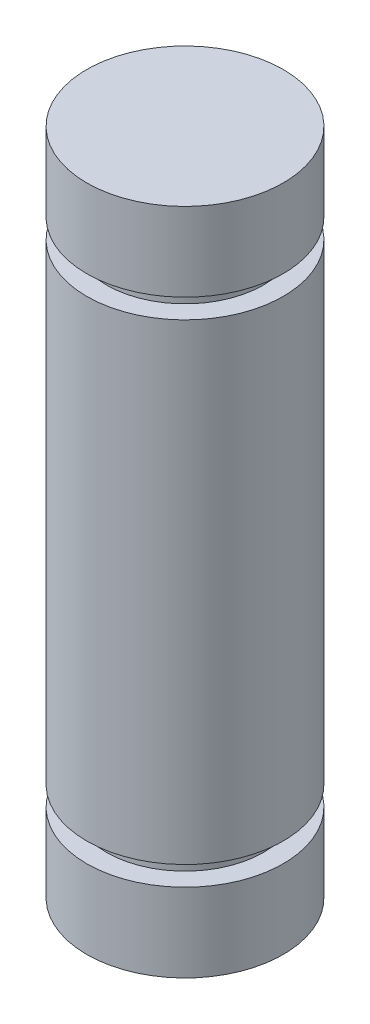
ISO-10303-21;
HEADER;
FILE_DESCRIPTION(('STEP AP214'),'2;1');
FILE_NAME('part.step','',(''),(''),'','','');
FILE_SCHEMA(('AUTOMOTIVE_DESIGN { 1 0 10303 214 1 1 1 1 }'));
ENDSEC;
DATA;
#1=APPLICATION_CONTEXT('core data for automotive mechanical design processes');
#2=APPLICATION_PROTOCOL_DEFINITION('international standard','automotive_design',2000,#1);
#3=PRODUCT_CONTEXT('',#1,'mechanical');
#4=PRODUCT('Part','Part','',(#3));
#5=PRODUCT_RELATED_PRODUCT_CATEGORY('part','',(#4));
#6=PRODUCT_DEFINITION_FORMATION('','',#4);
#7=PRODUCT_DEFINITION_CONTEXT('part definition',#1,'design');
#8=PRODUCT_DEFINITION('design','',#6,#7);
#9=PRODUCT_DEFINITION_SHAPE('','',#8);
#10=(LENGTH_UNIT() NAMED_UNIT(*) SI_UNIT(.MILLI.,.METRE.));
#11=(NAMED_UNIT(*) PLANE_ANGLE_UNIT() SI_UNIT($,.RADIAN.));
#12=(NAMED_UNIT(*) SI_UNIT($,.STERADIAN.) SOLID_ANGLE_UNIT());
#13=UNCERTAINTY_MEASURE_WITH_UNIT(LENGTH_MEASURE(1.E-05),#10,'distance_accuracy_value','');
#14=(GEOMETRIC_REPRESENTATION_CONTEXT(3) GLOBAL_UNCERTAINTY_ASSIGNED_CONTEXT((#13)) GLOBAL_UNIT_ASSIGNED_CONTEXT((#10,
#11,#12)) REPRESENTATION_CONTEXT('',''));
#15=CARTESIAN_POINT('',(0.,0.,0.));
#16=DIRECTION('',(0.,0.,1.));
#17=DIRECTION('',(1.,0.,0.));
#18=AXIS2_PLACEMENT_3D('',#15,#16,#17);
#19=CARTESIAN_POINT('',(0.,0.,0.));
#20=DIRECTION('',(0.,1.,0.));
#21=DIRECTION('',(0.,0.,1.));
#22=AXIS2_PLACEMENT_3D('',#19,#20,#21);
#23=PLANE('',#22);
#24=CARTESIAN_POINT('',(0.,0.,0.));
#25=DIRECTION('',(0.,1.,0.));
#26=DIRECTION('',(0.,0.,1.));
#27=AXIS2_PLACEMENT_3D('',#24,#25,#26);
#28=CIRCLE('',#27,6.35);
#29=CARTESIAN_POINT('',(0.,0.,-6.35));
#30=VERTEX_POINT('',#29);
#31=EDGE_CURVE('E42',#30,#30,#28,.T.);
#32=ORIENTED_EDGE('',*,*,#31,.F.);
#33=EDGE_LOOP('',(#32));
#34=FACE_BOUND('',#33,.T.);
#35=CARTESIAN_POINT('',(0.,0.,0.));
#36=DIRECTION('',(0.,1.,0.));
#37=DIRECTION('',(0.,0.,1.));
#38=AXIS2_PLACEMENT_3D('',#35,#36,#37);
#39=CIRCLE('',#38,5.08);
#40=CARTESIAN_POINT('',(0.,0.,5.08));
#41=VERTEX_POINT('',#40);
#42=EDGE_CURVE('E10',#41,#41,#39,.F.);
#43=ORIENTED_EDGE('',*,*,#42,.F.);
#44=EDGE_LOOP('',(#43));
#45=FACE_BOUND('',#44,.T.);
#46=ADVANCED_FACE('F31',(#34,#45),#23,.F.);
#47=CARTESIAN_POINT('',(0.,30.48,0.));
#48=DIRECTION('',(0.,1.,0.));
#49=DIRECTION('',(0.,0.,1.));
#50=AXIS2_PLACEMENT_3D('',#47,#48,#49);
#51=PLANE('',#50);
#52=CARTESIAN_POINT('',(0.,30.48,0.));
#53=DIRECTION('',(0.,1.,0.));
#54=DIRECTION('',(0.,0.,1.));
#55=AXIS2_PLACEMENT_3D('',#52,#53,#54);
#56=CIRCLE('',#55,6.35);
#57=CARTESIAN_POINT('',(0.,30.48,-6.35));
#58=VERTEX_POINT('',#57);
#59=EDGE_CURVE('E38',#58,#58,#56,.T.);
#60=ORIENTED_EDGE('',*,*,#59,.T.);
#61=EDGE_LOOP('',(#60));
#62=FACE_BOUND('',#61,.T.);
#63=CARTESIAN_POINT('',(0.,30.48,0.));
#64=DIRECTION('',(0.,1.,0.));
#65=DIRECTION('',(0.,0.,1.));
#66=AXIS2_PLACEMENT_3D('',#63,#64,#65);
#67=CIRCLE('',#66,5.08);
#68=CARTESIAN_POINT('',(0.,30.48,5.08));
#69=VERTEX_POINT('',#68);
#70=EDGE_CURVE('E49',#69,#69,#67,.T.);
#71=ORIENTED_EDGE('',*,*,#70,.F.);
#72=EDGE_LOOP('',(#71));
#73=FACE_BOUND('',#72,.T.);
#74=ADVANCED_FACE('F95',(#62,#73),#51,.T.);
#75=CARTESIAN_POINT('',(0.,30.48,0.));
#76=DIRECTION('',(0.,-1.,0.));
#77=DIRECTION('',(0.,0.,-1.));
#78=AXIS2_PLACEMENT_3D('',#75,#76,#77);
#79=CYLINDRICAL_SURFACE('',#78,6.35);
#80=CARTESIAN_POINT('',(0.,30.48,-6.35));
#81=CARTESIAN_POINT('',(0.,30.1625,-6.35));
#82=CARTESIAN_POINT('',(0.,29.845,-6.35));
#83=CARTESIAN_POINT('',(0.,29.21,-6.35));
#84=CARTESIAN_POINT('',(0.,28.8925,-6.35));
#85=CARTESIAN_POINT('',(0.,28.2575,-6.35));
#86=CARTESIAN_POINT('',(0.,27.94,-6.35));
#87=CARTESIAN_POINT('',(0.,27.305,-6.35));
#88=CARTESIAN_POINT('',(0.,26.9875,-6.35));
#89=CARTESIAN_POINT('',(0.,26.3525,-6.35));
#90=CARTESIAN_POINT('',(0.,26.035,-6.35));
#91=CARTESIAN_POINT('',(0.,25.4,-6.35));
#92=CARTESIAN_POINT('',(0.,25.0825,-6.35));
#93=CARTESIAN_POINT('',(0.,24.4475,-6.35));
#94=CARTESIAN_POINT('',(0.,24.13,-6.35));
#95=CARTESIAN_POINT('',(0.,23.495,-6.35));
#96=CARTESIAN_POINT('',(0.,23.1775,-6.35));
#97=CARTESIAN_POINT('',(0.,22.5425,-6.35));
#98=CARTESIAN_POINT('',(0.,22.225,-6.35));
#99=CARTESIAN_POINT('',(0.,21.59,-6.35));
#100=CARTESIAN_POINT('',(0.,21.2725,-6.35));
#101=CARTESIAN_POINT('',(0.,20.6375,-6.35));
#102=CARTESIAN_POINT('',(0.,20.32,-6.35));
#103=CARTESIAN_POINT('',(0.,19.685,-6.35));
#104=CARTESIAN_POINT('',(0.,19.3675,-6.35));
#105=CARTESIAN_POINT('',(0.,18.7325,-6.35));
#106=CARTESIAN_POINT('',(0.,18.415,-6.35));
#107=CARTESIAN_POINT('',(0.,17.78,-6.35));
#108=CARTESIAN_POINT('',(0.,17.4625,-6.35));
#109=CARTESIAN_POINT('',(0.,16.8275,-6.35));
#110=CARTESIAN_POINT('',(0.,16.51,-6.35));
#111=CARTESIAN_POINT('',(0.,15.875,-6.35));
#112=CARTESIAN_POINT('',(0.,15.5575,-6.35));
#113=CARTESIAN_POINT('',(0.,14.9225,-6.35));
#114=CARTESIAN_POINT('',(0.,14.605,-6.35));
#115=CARTESIAN_POINT('',(0.,13.97,-6.35));
#116=CARTESIAN_POINT('',(0.,13.6525,-6.35));
#117=CARTESIAN_POINT('',(0.,13.0175,-6.35));
#118=CARTESIAN_POINT('',(0.,12.7,-6.35));
#119=CARTESIAN_POINT('',(0.,12.065,-6.35));
#120=CARTESIAN_POINT('',(0.,11.7475,-6.35));
#121=CARTESIAN_POINT('',(0.,11.1125,-6.35));
#122=CARTESIAN_POINT('',(0.,10.795,-6.35));
#123=CARTESIAN_POINT('',(0.,10.16,-6.35));
#124=CARTESIAN_POINT('',(0.,9.8425,-6.35));
#125=CARTESIAN_POINT('',(0.,9.2075,-6.35));
#126=CARTESIAN_POINT('',(0.,8.89,-6.35));
#127=CARTESIAN_POINT('',(0.,8.255,-6.35));
#128=CARTESIAN_POINT('',(0.,7.9375,-6.35));
#129=CARTESIAN_POINT('',(0.,7.3025,-6.35));
#130=CARTESIAN_POINT('',(0.,6.985,-6.35));
#131=CARTESIAN_POINT('',(0.,6.35,-6.35));
#132=CARTESIAN_POINT('',(0.,6.0325,-6.35));
#133=CARTESIAN_POINT('',(0.,5.3975,-6.35));
#134=CARTESIAN_POINT('',(0.,5.08,-6.35));
#135=CARTESIAN_POINT('',(0.,4.445,-6.35));
#136=CARTESIAN_POINT('',(0.,4.1275,-6.35));
#137=CARTESIAN_POINT('',(0.,3.4925,-6.35));
#138=CARTESIAN_POINT('',(0.,3.175,-6.35));
#139=CARTESIAN_POINT('',(0.,2.54,-6.35));
#140=CARTESIAN_POINT('',(0.,2.2225,-6.35));
#141=CARTESIAN_POINT('',(0.,1.5875,-6.35));
#142=CARTESIAN_POINT('',(0.,1.27,-6.35));
#143=CARTESIAN_POINT('',(0.,0.634999999999999,-6.35));
#144=CARTESIAN_POINT('',(0.,0.3175,-6.35));
#145=CARTESIAN_POINT('',(0.,0.,-6.35));
#146=B_SPLINE_CURVE_WITH_KNOTS('',3,(#80,#81,#82,#83,#84,#85,#86,#87,#88,#89,#90,#91,#92,#93,
#94,#95,#96,#97,#98,#99,#100,#101,#102,#103,#104,#105,#106,#107,#108,#109,#110,#111,#112,#113,
#114,#115,#116,#117,#118,#119,#120,#121,#122,#123,#124,#125,#126,#127,#128,#129,#130,#131,#132,
#133,#134,#135,#136,#137,#138,#139,#140,#141,#142,#143,#144,#145),.UNSPECIFIED.,.F.,.F.,(4,2,2,
2,2,2,2,2,2,2,2,2,2,2,2,2,2,2,2,2,2,2,2,2,2,2,2,2,2,2,2,2,4),(0.,0.952499999999998,1.905,2.8575,
3.81,4.7625,5.715,6.6675,7.61999999999999,8.5725,9.525,10.4775,11.43,12.3825,13.335,14.2875,
15.24,16.1925,17.145,18.0975,19.05,20.0025,20.955,21.9075,22.86,23.8125,24.765,25.7175,26.67,
27.6225,28.575,29.5275,30.48),.UNSPECIFIED.);
#147=EDGE_CURVE('BSEAM33',#58,#30,#146,.T.);
#148=ORIENTED_EDGE('',*,*,#59,.F.);
#149=ORIENTED_EDGE('',*,*,#31,.T.);
#150=ORIENTED_EDGE('',*,*,#147,.T.);
#151=ORIENTED_EDGE('',*,*,#147,.F.);
#152=EDGE_LOOP('',(#148,#150,#149,#151));
#153=FACE_BOUND('',#152,.T.);
#154=ADVANCED_FACE('F33',(#153),#79,.T.);
#155=CARTESIAN_POINT('',(0.,31.75,0.));
#156=DIRECTION('',(0.,-1.,0.));
#157=DIRECTION('',(0.,0.,-1.));
#158=AXIS2_PLACEMENT_3D('',#155,#156,#157);
#159=CYLINDRICAL_SURFACE('',#158,5.08);
#160=CARTESIAN_POINT('',(0.,31.75,0.));
#161=DIRECTION('',(0.,1.,0.));
#162=DIRECTION('',(0.,0.,1.));
#163=AXIS2_PLACEMENT_3D('',#160,#161,#162);
#164=CIRCLE('',#163,5.08);
#165=CARTESIAN_POINT('',(0.,31.75,5.08));
#166=VERTEX_POINT('',#165);
#167=EDGE_CURVE('E47',#166,#166,#164,.T.);
#168=ORIENTED_EDGE('',*,*,#167,.F.);
#169=EDGE_LOOP('',(#168));
#170=FACE_BOUND('',#169,.T.);
#171=ORIENTED_EDGE('',*,*,#70,.T.);
#172=EDGE_LOOP('',(#171));
#173=FACE_BOUND('',#172,.T.);
#174=ADVANCED_FACE('F104',(#170,#173),#159,.T.);
#175=CARTESIAN_POINT('',(0.,31.75,0.));
#176=DIRECTION('',(0.,1.,0.));
#177=DIRECTION('',(0.,0.,1.));
#178=AXIS2_PLACEMENT_3D('',#175,#176,#177);
#179=PLANE('',#178);
#180=CARTESIAN_POINT('',(0.,31.75,0.));
#181=DIRECTION('',(0.,1.,0.));
#182=DIRECTION('',(0.,0.,1.));
#183=AXIS2_PLACEMENT_3D('',#180,#181,#182);
#184=CIRCLE('',#183,6.35);
#185=CARTESIAN_POINT('',(0.,31.75,6.35));
#186=VERTEX_POINT('',#185);
#187=EDGE_CURVE('E55',#186,#186,#184,.T.);
#188=ORIENTED_EDGE('',*,*,#187,.F.);
#189=EDGE_LOOP('',(#188));
#190=FACE_BOUND('',#189,.T.);
#191=ORIENTED_EDGE('',*,*,#167,.T.);
#192=EDGE_LOOP('',(#191));
#193=FACE_BOUND('',#192,.T.);
#194=ADVANCED_FACE('F107',(#190,#193),#179,.F.);
#195=CARTESIAN_POINT('',(0.,36.83,0.));
#196=DIRECTION('',(0.,-1.,0.));
#197=DIRECTION('',(0.,0.,-1.));
#198=AXIS2_PLACEMENT_3D('',#195,#196,#197);
#199=CYLINDRICAL_SURFACE('',#198,6.35);
#200=CARTESIAN_POINT('',(0.,36.83,0.));
#201=DIRECTION('',(0.,1.,0.));
#202=DIRECTION('',(0.,0.,1.));
#203=AXIS2_PLACEMENT_3D('',#200,#201,#202);
#204=CIRCLE('',#203,6.35);
#205=CARTESIAN_POINT('',(0.,36.83,6.35));
#206=VERTEX_POINT('',#205);
#207=EDGE_CURVE('E52',#206,#206,#204,.T.);
#208=ORIENTED_EDGE('',*,*,#207,.F.);
#209=EDGE_LOOP('',(#208));
#210=FACE_BOUND('',#209,.T.);
#211=ORIENTED_EDGE('',*,*,#187,.T.);
#212=EDGE_LOOP('',(#211));
#213=FACE_BOUND('',#212,.T.);
#214=ADVANCED_FACE('F91',(#210,#213),#199,.T.);
#215=CARTESIAN_POINT('',(0.,36.83,0.));
#216=DIRECTION('',(0.,1.,0.));
#217=DIRECTION('',(0.,0.,1.));
#218=AXIS2_PLACEMENT_3D('',#215,#216,#217);
#219=PLANE('',#218);
#220=ORIENTED_EDGE('',*,*,#207,.T.);
#221=EDGE_LOOP('',(#220));
#222=FACE_BOUND('',#221,.T.);
#223=ADVANCED_FACE('F86',(#222),#219,.T.);
#224=CARTESIAN_POINT('',(0.,-1.27,0.));
#225=DIRECTION('',(0.,1.,0.));
#226=DIRECTION('',(0.,0.,1.));
#227=AXIS2_PLACEMENT_3D('',#224,#225,#226);
#228=CYLINDRICAL_SURFACE('',#227,5.08);
#229=CARTESIAN_POINT('',(0.,-1.27,0.));
#230=DIRECTION('',(0.,-1.,0.));
#231=DIRECTION('',(0.,0.,-1.));
#232=AXIS2_PLACEMENT_3D('',#229,#230,#231);
#233=CIRCLE('',#232,5.08);
#234=CARTESIAN_POINT('',(0.,-1.27,-5.08));
#235=VERTEX_POINT('',#234);
#236=EDGE_CURVE('E58',#235,#235,#233,.T.);
#237=ORIENTED_EDGE('',*,*,#236,.F.);
#238=EDGE_LOOP('',(#237));
#239=FACE_BOUND('',#238,.T.);
#240=ORIENTED_EDGE('',*,*,#42,.T.);
#241=EDGE_LOOP('',(#240));
#242=FACE_BOUND('',#241,.T.);
#243=ADVANCED_FACE('F81',(#239,#242),#228,.T.);
#244=CARTESIAN_POINT('',(0.,-1.27,0.));
#245=DIRECTION('',(0.,-1.,0.));
#246=DIRECTION('',(0.,0.,-1.));
#247=AXIS2_PLACEMENT_3D('',#244,#245,#246);
#248=PLANE('',#247);
#249=CARTESIAN_POINT('',(0.,-1.27,0.));
#250=DIRECTION('',(0.,-1.,0.));
#251=DIRECTION('',(0.,0.,-1.));
#252=AXIS2_PLACEMENT_3D('',#249,#250,#251);
#253=CIRCLE('',#252,6.35);
#254=CARTESIAN_POINT('',(0.,-1.27,-6.35));
#255=VERTEX_POINT('',#254);
#256=EDGE_CURVE('E64',#255,#255,#253,.T.);
#257=ORIENTED_EDGE('',*,*,#256,.F.);
#258=EDGE_LOOP('',(#257));
#259=FACE_BOUND('',#258,.T.);
#260=ORIENTED_EDGE('',*,*,#236,.T.);
#261=EDGE_LOOP('',(#260));
#262=FACE_BOUND('',#261,.T.);
#263=ADVANCED_FACE('F75',(#259,#262),#248,.F.);
#264=CARTESIAN_POINT('',(0.,-6.35,0.));
#265=DIRECTION('',(0.,1.,0.));
#266=DIRECTION('',(0.,0.,1.));
#267=AXIS2_PLACEMENT_3D('',#264,#265,#266);
#268=CYLINDRICAL_SURFACE('',#267,6.35);
#269=CARTESIAN_POINT('',(0.,-6.35,0.));
#270=DIRECTION('',(0.,-1.,0.));
#271=DIRECTION('',(0.,0.,-1.));
#272=AXIS2_PLACEMENT_3D('',#269,#270,#271);
#273=CIRCLE('',#272,6.35);
#274=CARTESIAN_POINT('',(0.,-6.35,-6.35));
#275=VERTEX_POINT('',#274);
#276=EDGE_CURVE('E63',#275,#275,#273,.T.);
#277=ORIENTED_EDGE('',*,*,#276,.F.);
#278=EDGE_LOOP('',(#277));
#279=FACE_BOUND('',#278,.T.);
#280=ORIENTED_EDGE('',*,*,#256,.T.);
#281=EDGE_LOOP('',(#280));
#282=FACE_BOUND('',#281,.T.);
#283=ADVANCED_FACE('F72',(#279,#282),#268,.T.);
#284=CARTESIAN_POINT('',(0.,-6.35,0.));
#285=DIRECTION('',(0.,-1.,0.));
#286=DIRECTION('',(0.,0.,-1.));
#287=AXIS2_PLACEMENT_3D('',#284,#285,#286);
#288=PLANE('',#287);
#289=ORIENTED_EDGE('',*,*,#276,.T.);
#290=EDGE_LOOP('',(#289));
#291=FACE_BOUND('',#290,.T.);
#292=ADVANCED_FACE('F70',(#291),#288,.T.);
#293=CLOSED_SHELL('',(#46,#74,#154,#174,#194,#214,#223,#243,#263,#283,#292));
#294=MANIFOLD_SOLID_BREP('B2',#293);
#295=ADVANCED_BREP_SHAPE_REPRESENTATION('',(#18,#294),#14);
#296=SHAPE_DEFINITION_REPRESENTATION(#9,#295);
ENDSEC;
END-ISO-10303-21;
